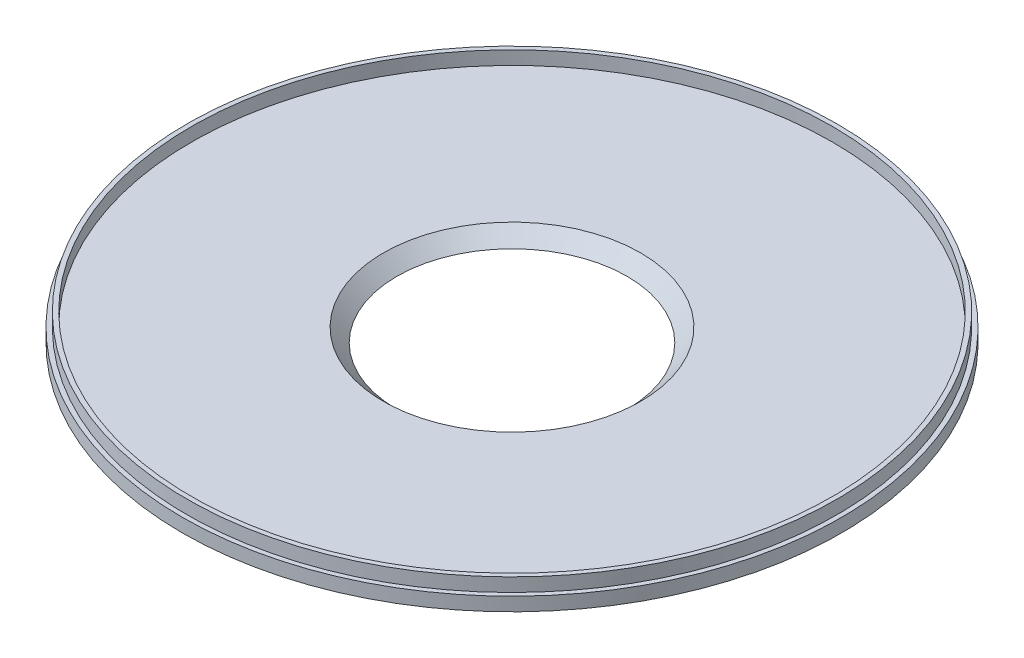
ISO-10303-21;
HEADER;
FILE_DESCRIPTION(('STEP AP214'),'2;1');
FILE_NAME('part.step','',(''),(''),'','','');
FILE_SCHEMA(('AUTOMOTIVE_DESIGN { 1 0 10303 214 1 1 1 1 }'));
ENDSEC;
DATA;
#1=APPLICATION_CONTEXT('core data for automotive mechanical design processes');
#2=APPLICATION_PROTOCOL_DEFINITION('international standard','automotive_design',2000,#1);
#3=PRODUCT_CONTEXT('',#1,'mechanical');
#4=PRODUCT('Part','Part','',(#3));
#5=PRODUCT_RELATED_PRODUCT_CATEGORY('part','',(#4));
#6=PRODUCT_DEFINITION_FORMATION('','',#4);
#7=PRODUCT_DEFINITION_CONTEXT('part definition',#1,'design');
#8=PRODUCT_DEFINITION('design','',#6,#7);
#9=PRODUCT_DEFINITION_SHAPE('','',#8);
#10=(LENGTH_UNIT() NAMED_UNIT(*) SI_UNIT(.MILLI.,.METRE.));
#11=(NAMED_UNIT(*) PLANE_ANGLE_UNIT() SI_UNIT($,.RADIAN.));
#12=(NAMED_UNIT(*) SI_UNIT($,.STERADIAN.) SOLID_ANGLE_UNIT());
#13=UNCERTAINTY_MEASURE_WITH_UNIT(LENGTH_MEASURE(1.E-05),#10,'distance_accuracy_value','');
#14=(GEOMETRIC_REPRESENTATION_CONTEXT(3) GLOBAL_UNCERTAINTY_ASSIGNED_CONTEXT((#13)) GLOBAL_UNIT_ASSIGNED_CONTEXT((#10,
#11,#12)) REPRESENTATION_CONTEXT('',''));
#15=CARTESIAN_POINT('',(0.,0.,0.));
#16=DIRECTION('',(0.,0.,1.));
#17=DIRECTION('',(1.,0.,0.));
#18=AXIS2_PLACEMENT_3D('',#15,#16,#17);
#19=CARTESIAN_POINT('',(-73.,0.,0.));
#20=DIRECTION('',(0.,1.,0.));
#21=DIRECTION('',(0.,0.,1.));
#22=AXIS2_PLACEMENT_3D('',#19,#20,#21);
#23=PLANE('',#22);
#24=CARTESIAN_POINT('',(0.,0.,0.));
#25=DIRECTION('',(0.,-1.,0.));
#26=DIRECTION('',(0.,0.,-1.));
#27=AXIS2_PLACEMENT_3D('',#24,#25,#26);
#28=CIRCLE('',#27,25.5);
#29=CARTESIAN_POINT('',(0.,0.,-25.5));
#30=VERTEX_POINT('',#29);
#31=EDGE_CURVE('E47',#30,#30,#28,.T.);
#32=ORIENTED_EDGE('',*,*,#31,.F.);
#33=EDGE_LOOP('',(#32));
#34=FACE_BOUND('',#33,.T.);
#35=CARTESIAN_POINT('',(0.,0.,0.));
#36=DIRECTION('',(0.,-1.,0.));
#37=DIRECTION('',(0.,0.,-1.));
#38=AXIS2_PLACEMENT_3D('',#35,#36,#37);
#39=CIRCLE('',#38,73.);
#40=CARTESIAN_POINT('',(0.,0.,-73.));
#41=VERTEX_POINT('',#40);
#42=EDGE_CURVE('E69',#41,#41,#39,.T.);
#43=ORIENTED_EDGE('',*,*,#42,.T.);
#44=EDGE_LOOP('',(#43));
#45=FACE_BOUND('',#44,.T.);
#46=ADVANCED_FACE('F39',(#34,#45),#23,.F.);
#47=CARTESIAN_POINT('',(-25.5,3.,0.));
#48=DIRECTION('',(0.,-1.,0.));
#49=DIRECTION('',(0.,0.,-1.));
#50=AXIS2_PLACEMENT_3D('',#47,#48,#49);
#51=PLANE('',#50);
#52=CARTESIAN_POINT('',(0.,3.,0.));
#53=DIRECTION('',(0.,-1.,0.));
#54=DIRECTION('',(0.,0.,-1.));
#55=AXIS2_PLACEMENT_3D('',#52,#53,#54);
#56=CIRCLE('',#55,28.5);
#57=CARTESIAN_POINT('',(0.,3.,-28.5));
#58=VERTEX_POINT('',#57);
#59=EDGE_CURVE('E10',#58,#58,#56,.T.);
#60=ORIENTED_EDGE('',*,*,#59,.T.);
#61=EDGE_LOOP('',(#60));
#62=FACE_BOUND('',#61,.T.);
#63=CARTESIAN_POINT('',(0.,3.,0.));
#64=DIRECTION('',(0.,-1.,0.));
#65=DIRECTION('',(0.,0.,-1.));
#66=AXIS2_PLACEMENT_3D('',#63,#64,#65);
#67=CIRCLE('',#66,71.);
#68=CARTESIAN_POINT('',(0.,3.,-71.));
#69=VERTEX_POINT('',#68);
#70=EDGE_CURVE('E51',#69,#69,#67,.T.);
#71=ORIENTED_EDGE('',*,*,#70,.F.);
#72=EDGE_LOOP('',(#71));
#73=FACE_BOUND('',#72,.T.);
#74=ADVANCED_FACE('F101',(#62,#73),#51,.F.);
#75=CARTESIAN_POINT('',(0.,0.,0.));
#76=DIRECTION('',(0.,-1.,0.));
#77=DIRECTION('',(0.,0.,-1.));
#78=AXIS2_PLACEMENT_3D('',#75,#76,#77);
#79=CYLINDRICAL_SURFACE('',#78,71.);
#80=CARTESIAN_POINT('',(0.,6.,0.));
#81=DIRECTION('',(0.,-1.,0.));
#82=DIRECTION('',(0.,0.,-1.));
#83=AXIS2_PLACEMENT_3D('',#80,#81,#82);
#84=CIRCLE('',#83,71.);
#85=CARTESIAN_POINT('',(0.,6.,-71.));
#86=VERTEX_POINT('',#85);
#87=EDGE_CURVE('E55',#86,#86,#84,.T.);
#88=ORIENTED_EDGE('',*,*,#87,.F.);
#89=EDGE_LOOP('',(#88));
#90=FACE_BOUND('',#89,.T.);
#91=ORIENTED_EDGE('',*,*,#70,.T.);
#92=EDGE_LOOP('',(#91));
#93=FACE_BOUND('',#92,.T.);
#94=ADVANCED_FACE('F95',(#90,#93),#79,.F.);
#95=CARTESIAN_POINT('',(-71.,6.,0.));
#96=DIRECTION('',(0.,-1.,0.));
#97=DIRECTION('',(0.,0.,-1.));
#98=AXIS2_PLACEMENT_3D('',#95,#96,#97);
#99=PLANE('',#98);
#100=CARTESIAN_POINT('',(0.,6.,0.));
#101=DIRECTION('',(0.,-1.,0.));
#102=DIRECTION('',(0.,0.,-1.));
#103=AXIS2_PLACEMENT_3D('',#100,#101,#102);
#104=CIRCLE('',#103,72.);
#105=CARTESIAN_POINT('',(0.,6.,-72.));
#106=VERTEX_POINT('',#105);
#107=EDGE_CURVE('E60',#106,#106,#104,.T.);
#108=ORIENTED_EDGE('',*,*,#107,.F.);
#109=EDGE_LOOP('',(#108));
#110=FACE_BOUND('',#109,.T.);
#111=ORIENTED_EDGE('',*,*,#87,.T.);
#112=EDGE_LOOP('',(#111));
#113=FACE_BOUND('',#112,.T.);
#114=ADVANCED_FACE('F89',(#110,#113),#99,.F.);
#115=CARTESIAN_POINT('',(0.,0.,0.));
#116=DIRECTION('',(0.,-1.,0.));
#117=DIRECTION('',(0.,0.,-1.));
#118=AXIS2_PLACEMENT_3D('',#115,#116,#117);
#119=CYLINDRICAL_SURFACE('',#118,72.);
#120=CARTESIAN_POINT('',(0.,3.,0.));
#121=DIRECTION('',(0.,-1.,0.));
#122=DIRECTION('',(0.,0.,-1.));
#123=AXIS2_PLACEMENT_3D('',#120,#121,#122);
#124=CIRCLE('',#123,72.);
#125=CARTESIAN_POINT('',(0.,3.,-72.));
#126=VERTEX_POINT('',#125);
#127=EDGE_CURVE('E63',#126,#126,#124,.T.);
#128=ORIENTED_EDGE('',*,*,#127,.F.);
#129=EDGE_LOOP('',(#128));
#130=FACE_BOUND('',#129,.T.);
#131=ORIENTED_EDGE('',*,*,#107,.T.);
#132=EDGE_LOOP('',(#131));
#133=FACE_BOUND('',#132,.T.);
#134=ADVANCED_FACE('F83',(#130,#133),#119,.T.);
#135=CARTESIAN_POINT('',(-72.,3.,0.));
#136=DIRECTION('',(0.,-1.,0.));
#137=DIRECTION('',(0.,0.,-1.));
#138=AXIS2_PLACEMENT_3D('',#135,#136,#137);
#139=PLANE('',#138);
#140=CARTESIAN_POINT('',(0.,3.,0.));
#141=DIRECTION('',(0.,-1.,0.));
#142=DIRECTION('',(0.,0.,-1.));
#143=AXIS2_PLACEMENT_3D('',#140,#141,#142);
#144=CIRCLE('',#143,73.);
#145=CARTESIAN_POINT('',(0.,3.,-73.));
#146=VERTEX_POINT('',#145);
#147=EDGE_CURVE('E66',#146,#146,#144,.T.);
#148=ORIENTED_EDGE('',*,*,#147,.F.);
#149=EDGE_LOOP('',(#148));
#150=FACE_BOUND('',#149,.T.);
#151=ORIENTED_EDGE('',*,*,#127,.T.);
#152=EDGE_LOOP('',(#151));
#153=FACE_BOUND('',#152,.T.);
#154=ADVANCED_FACE('F77',(#150,#153),#139,.F.);
#155=CARTESIAN_POINT('',(0.,0.,0.));
#156=DIRECTION('',(0.,-1.,0.));
#157=DIRECTION('',(0.,0.,-1.));
#158=AXIS2_PLACEMENT_3D('',#155,#156,#157);
#159=CYLINDRICAL_SURFACE('',#158,73.);
#160=ORIENTED_EDGE('',*,*,#42,.F.);
#161=EDGE_LOOP('',(#160));
#162=FACE_BOUND('',#161,.T.);
#163=ORIENTED_EDGE('',*,*,#147,.T.);
#164=EDGE_LOOP('',(#163));
#165=FACE_BOUND('',#164,.T.);
#166=ADVANCED_FACE('F74',(#162,#165),#159,.T.);
#167=CARTESIAN_POINT('',(0.,3.,0.));
#168=DIRECTION('',(0.,1.,0.));
#169=DIRECTION('',(0.,0.,1.));
#170=AXIS2_PLACEMENT_3D('',#167,#168,#169);
#171=CONICAL_SURFACE('',#170,28.5,0.785398163397449);
#172=ORIENTED_EDGE('',*,*,#31,.T.);
#173=EDGE_LOOP('',(#172));
#174=FACE_BOUND('',#173,.T.);
#175=ORIENTED_EDGE('',*,*,#59,.F.);
#176=EDGE_LOOP('',(#175));
#177=FACE_BOUND('',#176,.T.);
#178=ADVANCED_FACE('F42',(#174,#177),#171,.F.);
#179=CLOSED_SHELL('',(#46,#74,#94,#114,#134,#154,#166,#178));
#180=MANIFOLD_SOLID_BREP('B2',#179);
#181=ADVANCED_BREP_SHAPE_REPRESENTATION('',(#18,#180),#14);
#182=SHAPE_DEFINITION_REPRESENTATION(#9,#181);
ENDSEC;
END-ISO-10303-21;
